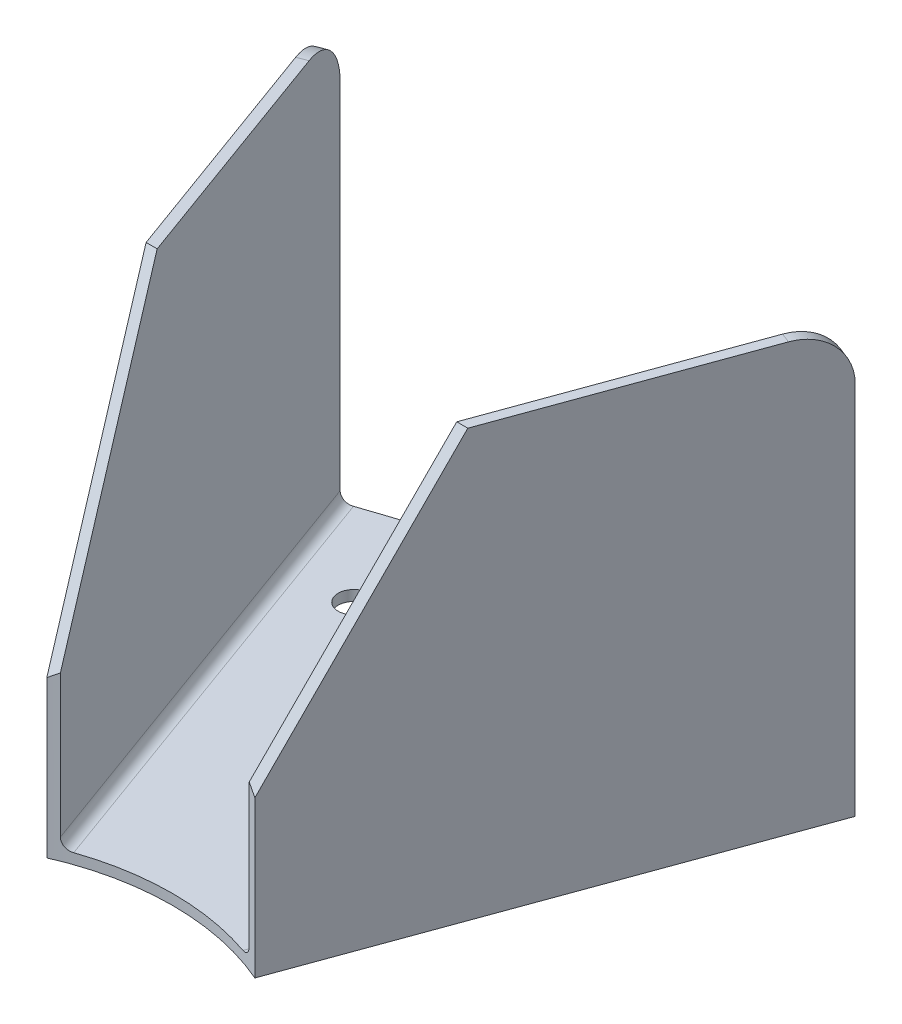
ISO-10303-21;
HEADER;
FILE_DESCRIPTION(('STEP AP214'),'2;1');
FILE_NAME('part.step','',(''),(''),'','','');
FILE_SCHEMA(('AUTOMOTIVE_DESIGN { 1 0 10303 214 1 1 1 1 }'));
ENDSEC;
DATA;
#1=APPLICATION_CONTEXT('core data for automotive mechanical design processes');
#2=APPLICATION_PROTOCOL_DEFINITION('international standard','automotive_design',2000,#1);
#3=PRODUCT_CONTEXT('',#1,'mechanical');
#4=PRODUCT('Part','Part','',(#3));
#5=PRODUCT_RELATED_PRODUCT_CATEGORY('part','',(#4));
#6=PRODUCT_DEFINITION_FORMATION('','',#4);
#7=PRODUCT_DEFINITION_CONTEXT('part definition',#1,'design');
#8=PRODUCT_DEFINITION('design','',#6,#7);
#9=PRODUCT_DEFINITION_SHAPE('','',#8);
#10=(LENGTH_UNIT() NAMED_UNIT(*) SI_UNIT(.MILLI.,.METRE.));
#11=(NAMED_UNIT(*) PLANE_ANGLE_UNIT() SI_UNIT($,.RADIAN.));
#12=(NAMED_UNIT(*) SI_UNIT($,.STERADIAN.) SOLID_ANGLE_UNIT());
#13=UNCERTAINTY_MEASURE_WITH_UNIT(LENGTH_MEASURE(1.E-05),#10,'distance_accuracy_value','');
#14=(GEOMETRIC_REPRESENTATION_CONTEXT(3) GLOBAL_UNCERTAINTY_ASSIGNED_CONTEXT((#13)) GLOBAL_UNIT_ASSIGNED_CONTEXT((#10,
#11,#12)) REPRESENTATION_CONTEXT('',''));
#15=CARTESIAN_POINT('',(0.,0.,0.));
#16=DIRECTION('',(0.,0.,1.));
#17=DIRECTION('',(1.,0.,0.));
#18=AXIS2_PLACEMENT_3D('',#15,#16,#17);
#19=CARTESIAN_POINT('',(-0.526472401888214,40.,0.191620283449944));
#20=DIRECTION('',(0.939692620785908,0.,-0.34202014332567));
#21=DIRECTION('',(-0.34202014332567,0.,-0.939692620785908));
#22=AXIS2_PLACEMENT_3D('',#19,#20,#21);
#23=PLANE('',#22);
#24=DIRECTION('',(-0.1790444180605,0.852031291837945,-0.491920495700615));
#25=VECTOR('',#24,1.);
#26=CARTESIAN_POINT('',(-10.5976391005752,21.9082050838659,-27.4786828087559));
#27=LINE('',#26,#25);
#28=CARTESIAN_POINT('',(-9.0748285709005,14.6614992838294,-23.2947952643669));
#29=VERTEX_POINT('',#28);
#30=CARTESIAN_POINT('',(-14.3994183585197,40.,-37.9239854737093));
#31=VERTEX_POINT('',#30);
#32=EDGE_CURVE('E62',#29,#31,#27,.T.);
#33=ORIENTED_EDGE('',*,*,#32,.F.);
#34=DIRECTION('',(0.,-1.,0.));
#35=VECTOR('',#34,1.);
#36=CARTESIAN_POINT('',(-9.0748285709005,40.,-23.2947952643669));
#37=LINE('',#36,#35);
#38=CARTESIAN_POINT('',(-9.0748285709005,1.,-23.2947952643669));
#39=VERTEX_POINT('',#38);
#40=EDGE_CURVE('E172',#29,#39,#37,.T.);
#41=ORIENTED_EDGE('',*,*,#40,.T.);
#42=DIRECTION('',(0.34202014332567,0.,0.939692620785908));
#43=VECTOR('',#42,1.);
#44=CARTESIAN_POINT('',(-24.4671155850919,1.,-65.5847562696222));
#45=LINE('',#44,#43);
#46=CARTESIAN_POINT('',(-24.4671155850919,1.,-65.5847562696222));
#47=VERTEX_POINT('',#46);
#48=EDGE_CURVE('E203',#39,#47,#45,.F.);
#49=ORIENTED_EDGE('',*,*,#48,.T.);
#50=DIRECTION('',(0.,-1.,0.));
#51=VECTOR('',#50,1.);
#52=CARTESIAN_POINT('',(-24.4671155850919,40.,-65.5847562696222));
#53=LINE('',#52,#51);
#54=CARTESIAN_POINT('',(-24.4671155850919,35.,-65.5847562696222));
#55=VERTEX_POINT('',#54);
#56=EDGE_CURVE('E188',#55,#47,#53,.T.);
#57=ORIENTED_EDGE('',*,*,#56,.F.);
#58=CARTESIAN_POINT('',(-24.4671155850919,35.,-65.5847562696222));
#59=CARTESIAN_POINT('',(-24.4671207581272,35.1406269312942,-65.5847704824198));
#60=CARTESIAN_POINT('',(-24.4650866069406,35.2812516905193,-65.5791816979669));
#61=CARTESIAN_POINT('',(-24.4569770188882,35.5614950485873,-65.556900787912));
#62=CARTESIAN_POINT('',(-24.4509017761162,35.7011136954282,-65.5402091955782));
#63=CARTESIAN_POINT('',(-24.434753469163,35.9782518827279,-65.4958420868619));
#64=CARTESIAN_POINT('',(-24.4246834316945,36.1157729307322,-65.4681748863041));
#65=CARTESIAN_POINT('',(-24.4006188018623,36.3878456902409,-65.4020578592325));
#66=CARTESIAN_POINT('',(-24.3866242573618,36.5223974379372,-65.3636081642219));
#67=CARTESIAN_POINT('',(-24.3548047471376,36.7876174779682,-65.2761847783828));
#68=CARTESIAN_POINT('',(-24.3369786252033,36.9182845845017,-65.2272079108918));
#69=CARTESIAN_POINT('',(-24.2976180117253,37.1748116237546,-65.1190655141452));
#70=CARTESIAN_POINT('',(-24.2760821518647,37.3006697617088,-65.0598962254695));
#71=CARTESIAN_POINT('',(-24.2294725130444,37.5465654777314,-64.9318372952818));
#72=CARTESIAN_POINT('',(-24.2044006685696,37.6666061904979,-64.8629529687234));
#73=CARTESIAN_POINT('',(-24.1508785102683,37.9001306439413,-64.7159020473499));
#74=CARTESIAN_POINT('',(-24.122426955461,38.0136119532219,-64.6377320429686));
#75=CARTESIAN_POINT('',(-24.062366118198,38.2331225135462,-64.4727162487948));
#76=CARTESIAN_POINT('',(-24.0307579967945,38.3391544803486,-64.3858736489675));
#77=CARTESIAN_POINT('',(-23.9645875878421,38.5430968254675,-64.2040719445345));
#78=CARTESIAN_POINT('',(-23.9300242041962,38.6410041636235,-64.1091098284275));
#79=CARTESIAN_POINT('',(-23.8582052344406,38.8279413115187,-63.9117888307355));
#80=CARTESIAN_POINT('',(-23.8209501016692,38.9169726101575,-63.8094311946873));
#81=CARTESIAN_POINT('',(-23.7439936596898,39.0855736702505,-63.5979951080673));
#82=CARTESIAN_POINT('',(-23.7042914852554,39.1651400556211,-63.4889142803057));
#83=CARTESIAN_POINT('',(-23.6227332726172,39.3142121744254,-63.264834932711));
#84=CARTESIAN_POINT('',(-23.5808771340836,39.3837174386453,-63.1498361372246));
#85=CARTESIAN_POINT('',(-23.4953108629168,39.512168726659,-62.9147447393268));
#86=CARTESIAN_POINT('',(-23.4516007222954,39.5711147049515,-62.7946521149683));
#87=CARTESIAN_POINT('',(-23.362656654915,39.6780026626812,-62.5502802982461));
#88=CARTESIAN_POINT('',(-23.3174234705589,39.725949916853,-62.4260031456179));
#89=CARTESIAN_POINT('',(-23.2257534026826,39.8105248265287,-62.1741417040877));
#90=CARTESIAN_POINT('',(-23.1793167835459,39.8471549458339,-62.0465581415738));
#91=CARTESIAN_POINT('',(-23.0708299962405,39.9185269177989,-61.748493143143));
#92=CARTESIAN_POINT('',(-23.0084479991648,39.9490783223824,-61.5771000147972));
#93=CARTESIAN_POINT('',(-22.9143740615055,39.979627736881,-61.3186339953189));
#94=CARTESIAN_POINT('',(-22.8829485663546,39.9872645862398,-61.2322931569967));
#95=CARTESIAN_POINT('',(-22.8200032508854,39.9974501039267,-61.0593523240847));
#96=CARTESIAN_POINT('',(-22.7884834366713,39.9999990946953,-60.972752346266));
#97=CARTESIAN_POINT('',(-22.7569558779202,40.,-60.8861310905069));
#98=B_SPLINE_CURVE_WITH_KNOTS('',3,(#58,#59,#60,#61,#62,#63,#64,#65,#66,#67,#68,#69,#70,#71,#72,
#73,#74,#75,#76,#77,#78,#79,#80,#81,#82,#83,#84,#85,#86,#87,#88,#89,#90,#91,#92,#93,#94,#95,#96,
#97),.UNSPECIFIED.,.F.,.F.,(4,2,2,2,2,2,2,2,2,2,2,2,2,2,2,2,2,2,2,4),(0.,0.421752020546427,
0.843483785798195,1.26489662843039,1.68630433173494,2.10783937732101,2.5295302380873,
2.95099128653435,3.37260757052777,3.7940693423049,4.21568811662169,4.63723604763235,
5.05893389449125,5.48065140145772,5.902370725614,6.32388737810006,6.74531219937262,
7.29882633295202,7.57530467568675,7.85176549618931),.UNSPECIFIED.);
#99=CARTESIAN_POINT('',(-22.7569558779202,40.,-60.8861310905069));
#100=VERTEX_POINT('',#99);
#101=EDGE_CURVE('E336',#55,#100,#98,.T.);
#102=ORIENTED_EDGE('',*,*,#101,.T.);
#103=DIRECTION('',(0.34202014332567,0.,0.939692620785908));
#104=VECTOR('',#103,1.);
#105=CARTESIAN_POINT('',(-0.526472401888214,40.,0.191620283449944));
#106=LINE('',#105,#104);
#107=EDGE_CURVE('E173',#100,#31,#106,.T.);
#108=ORIENTED_EDGE('',*,*,#107,.T.);
#109=EDGE_LOOP('',(#33,#41,#49,#57,#102,#108));
#110=FACE_BOUND('',#109,.T.);
#111=ADVANCED_FACE('F45',(#110),#23,.T.);
#112=CARTESIAN_POINT('',(0.,40.,0.));
#113=DIRECTION('',(0.,-1.,0.));
#114=DIRECTION('',(0.,0.,-1.));
#115=AXIS2_PLACEMENT_3D('',#112,#113,#114);
#116=CYLINDRICAL_SURFACE('',#115,70.);
#117=DIRECTION('',(0.,-1.,0.));
#118=VECTOR('',#117,1.);
#119=CARTESIAN_POINT('',(-25.401627045652,40.,-65.2285010055697));
#120=LINE('',#119,#118);
#121=CARTESIAN_POINT('',(-25.401627045652,35.,-65.2285010055697));
#122=VERTEX_POINT('',#121);
#123=CARTESIAN_POINT('',(-25.401627045652,-1.,-65.2285010055697));
#124=VERTEX_POINT('',#123);
#125=EDGE_CURVE('E185',#122,#124,#120,.T.);
#126=ORIENTED_EDGE('',*,*,#125,.F.);
#127=CARTESIAN_POINT('',(0.,35.,0.));
#128=DIRECTION('',(0.,1.,0.));
#129=DIRECTION('',(0.,0.,1.));
#130=AXIS2_PLACEMENT_3D('',#127,#128,#129);
#131=CIRCLE('',#130,70.);
#132=EDGE_CURVE('E339',#122,#55,#131,.F.);
#133=ORIENTED_EDGE('',*,*,#132,.T.);
#134=ORIENTED_EDGE('',*,*,#56,.T.);
#135=CARTESIAN_POINT('',(-24.4671155850919,1.,-65.5847562696222));
#136=CARTESIAN_POINT('',(-24.4671153767392,0.971865612568525,-65.5847562426265));
#137=CARTESIAN_POINT('',(-24.4660024294023,0.943744704289793,-65.5851715560531));
#138=CARTESIAN_POINT('',(-24.4615622153202,0.887704127962781,-65.5868278109534));
#139=CARTESIAN_POINT('',(-24.4582350551391,0.859784450295172,-65.5880687126938));
#140=CARTESIAN_POINT('',(-24.4449634506258,0.77667614422931,-65.5930168311897));
#141=CARTESIAN_POINT('',(-24.4317287963177,0.722044228048577,-65.5979494988282));
#142=CARTESIAN_POINT('',(-24.3968470145749,0.61592861285215,-65.610930476103));
#143=CARTESIAN_POINT('',(-24.3751958546124,0.564446436649627,-65.6189802792184));
#144=CARTESIAN_POINT('',(-24.3240890918427,0.466092124489214,-65.6379419982962));
#145=CARTESIAN_POINT('',(-24.2946348585797,0.419219181526669,-65.6488534120041));
#146=CARTESIAN_POINT('',(-24.2287459966497,0.331412703354947,-65.6731992310241));
#147=CARTESIAN_POINT('',(-24.1923112914872,0.290479233242181,-65.6866336639847));
#148=CARTESIAN_POINT('',(-24.113474343177,0.215703858837523,-65.7156154576214));
#149=CARTESIAN_POINT('',(-24.0710709367759,0.181863340114439,-65.7311632301508));
#150=CARTESIAN_POINT('',(-23.9814928716657,0.122241073469341,-65.7638979373127));
#151=CARTESIAN_POINT('',(-23.9343173551698,0.0964607777916381,-65.7810851666058));
#152=CARTESIAN_POINT('',(-23.8365371381719,0.0537087244860233,-65.8165799380348));
#153=CARTESIAN_POINT('',(-23.7859344662295,0.0367318067076425,-65.8348868168298));
#154=CARTESIAN_POINT('',(-23.7004723700059,0.0162868888596364,-65.8656884132503));
#155=CARTESIAN_POINT('',(-23.6661630190284,0.0101829767043095,-65.8780241062779));
#156=CARTESIAN_POINT('',(-23.5971497167369,0.00204006450139895,-65.9027759717542));
#157=CARTESIAN_POINT('',(-23.5624463948189,-4.69444307307017E-06,-65.915192005076));
#158=CARTESIAN_POINT('',(-23.5277174035234,0.,-65.927585378049));
#159=B_SPLINE_CURVE_WITH_KNOTS('',3,(#135,#136,#137,#138,#139,#140,#141,#142,#143,#144,#145,
#146,#147,#148,#149,#150,#151,#152,#153,#154,#155,#156,#157,#158),.UNSPECIFIED.,.F.,.F.,(4,2,2,
2,2,2,2,2,2,2,2,4),(0.,0.084351317746401,0.16869857618304,0.337114638855711,0.50561149292018,
0.674078793096854,0.842547939529672,1.01104996486976,1.17958233245656,1.34801580184459,
1.4587063183046,1.56923968076844),.UNSPECIFIED.);
#160=CARTESIAN_POINT('',(-23.5277174035234,0.,-65.927585378049));
#161=VERTEX_POINT('',#160);
#162=EDGE_CURVE('E249',#47,#161,#159,.T.);
#163=ORIENTED_EDGE('',*,*,#162,.T.);
#164=CARTESIAN_POINT('',(0.,0.,0.));
#165=DIRECTION('',(0.,1.,0.));
#166=DIRECTION('',(0.,0.,1.));
#167=AXIS2_PLACEMENT_3D('',#164,#165,#166);
#168=CIRCLE('',#167,70.);
#169=CARTESIAN_POINT('',(23.5277174035233,0.,-65.927585378049));
#170=VERTEX_POINT('',#169);
#171=EDGE_CURVE('E388',#170,#161,#168,.T.);
#172=ORIENTED_EDGE('',*,*,#171,.F.);
#173=CARTESIAN_POINT('',(23.5277174035233,0.,-65.927585378049));
#174=CARTESIAN_POINT('',(23.5542133133953,1.85724415020578E-07,-65.9181298273006));
#175=CARTESIAN_POINT('',(23.5806907610956,0.00118785924776186,-65.9086626334271));
#176=CARTESIAN_POINT('',(23.6334449436331,0.00592601743433827,-65.8897644803122));
#177=CARTESIAN_POINT('',(23.6597216880303,0.0094763888365024,-65.8803335193558));
#178=CARTESIAN_POINT('',(23.7379228249128,0.023637866369052,-65.8522138893208));
#179=CARTESIAN_POINT('',(23.7893067113295,0.037759429242583,-65.8336668507775));
#180=CARTESIAN_POINT('',(23.8890737153025,0.0749723676156303,-65.7975302109461));
#181=CARTESIAN_POINT('',(23.9374553788215,0.0980680507436286,-65.7799410740861));
#182=CARTESIAN_POINT('',(24.029852781733,0.152571251529126,-65.7462439532642));
#183=CARTESIAN_POINT('',(24.0738692856998,0.183977310045192,-65.7301357099543));
#184=CARTESIAN_POINT('',(24.1562990038814,0.254211066845318,-65.6998869894229));
#185=CARTESIAN_POINT('',(24.1947121426437,0.29303886505115,-65.685746538699));
#186=CARTESIAN_POINT('',(24.2648657343731,0.377024198843788,-65.659863635312));
#187=CARTESIAN_POINT('',(24.2966048792724,0.422182972383206,-65.6481216527491));
#188=CARTESIAN_POINT('',(24.3525169090188,0.517547968715458,-65.6274013865054));
#189=CARTESIAN_POINT('',(24.3766878726105,0.567755468909185,-65.6184238046038));
#190=CARTESIAN_POINT('',(24.4167670542365,0.671776833091942,-65.6035208401525));
#191=CARTESIAN_POINT('',(24.4326801101471,0.725588564637894,-65.5975936705426));
#192=CARTESIAN_POINT('',(24.4518462127297,0.816441020592758,-65.5904511519983));
#193=CARTESIAN_POINT('',(24.4575688760682,0.852910338169047,-65.5883172005882));
#194=CARTESIAN_POINT('',(24.4652030065165,0.926248007012693,-65.5854697822946));
#195=CARTESIAN_POINT('',(24.4671198701293,0.963115718626204,-65.5847543040633));
#196=CARTESIAN_POINT('',(24.4671155850919,1.,-65.5847562696222));
#197=B_SPLINE_CURVE_WITH_KNOTS('',3,(#173,#174,#175,#176,#177,#178,#179,#180,#181,#182,#183,
#184,#185,#186,#187,#188,#189,#190,#191,#192,#193,#194,#195,#196),.UNSPECIFIED.,.F.,.F.,(4,2,2,
2,2,2,2,2,2,2,2,4),(0.,0.0843458319249471,0.168687620840082,0.337092595899858,0.505578506358324,
0.674034853551556,0.842493468897966,1.01098507053813,1.17951941077155,1.34795490376494,
1.45867589442517,1.56923977379668),.UNSPECIFIED.);
#198=CARTESIAN_POINT('',(24.4671155850919,1.,-65.5847562696222));
#199=VERTEX_POINT('',#198);
#200=EDGE_CURVE('E207',#170,#199,#197,.T.);
#201=ORIENTED_EDGE('',*,*,#200,.T.);
#202=DIRECTION('',(0.,-1.,0.));
#203=VECTOR('',#202,1.);
#204=CARTESIAN_POINT('',(24.4671155850919,40.,-65.5847562696222));
#205=LINE('',#204,#203);
#206=CARTESIAN_POINT('',(24.4671155850919,35.,-65.5847562696222));
#207=VERTEX_POINT('',#206);
#208=EDGE_CURVE('E358',#207,#199,#205,.T.);
#209=ORIENTED_EDGE('',*,*,#208,.F.);
#210=CARTESIAN_POINT('',(0.,35.,0.));
#211=DIRECTION('',(0.,1.,0.));
#212=DIRECTION('',(0.,0.,1.));
#213=AXIS2_PLACEMENT_3D('',#210,#211,#212);
#214=CIRCLE('',#213,70.);
#215=CARTESIAN_POINT('',(25.401627045652,35.,-65.2285010055697));
#216=VERTEX_POINT('',#215);
#217=EDGE_CURVE('E265',#207,#216,#214,.F.);
#218=ORIENTED_EDGE('',*,*,#217,.T.);
#219=DIRECTION('',(0.,1.,0.));
#220=VECTOR('',#219,1.);
#221=CARTESIAN_POINT('',(25.401627045652,-1.,-65.2285010055697));
#222=LINE('',#221,#220);
#223=CARTESIAN_POINT('',(25.401627045652,-1.,-65.2285010055697));
#224=VERTEX_POINT('',#223);
#225=EDGE_CURVE('E179',#224,#216,#222,.T.);
#226=ORIENTED_EDGE('',*,*,#225,.F.);
#227=CARTESIAN_POINT('',(0.,-1.,0.));
#228=DIRECTION('',(0.,1.,0.));
#229=DIRECTION('',(0.,0.,1.));
#230=AXIS2_PLACEMENT_3D('',#227,#228,#229);
#231=CIRCLE('',#230,70.);
#232=EDGE_CURVE('E391',#224,#124,#231,.T.);
#233=ORIENTED_EDGE('',*,*,#232,.T.);
#234=EDGE_LOOP('',(#126,#133,#134,#163,#172,#201,#209,#218,#226,#233));
#235=FACE_BOUND('',#234,.T.);
#236=ADVANCED_FACE('F224',(#235),#116,.T.);
#237=CARTESIAN_POINT('',(-1.46616502267413,40.,0.533640426775616));
#238=DIRECTION('',(-0.939692620785908,0.,0.342020143325669));
#239=DIRECTION('',(0.342020143325669,0.,0.939692620785908));
#240=AXIS2_PLACEMENT_3D('',#237,#238,#239);
#241=PLANE('',#240);
#242=DIRECTION('',(0.1790444180605,-0.852031291837945,0.491920495700615));
#243=VECTOR('',#242,1.);
#244=CARTESIAN_POINT('',(-11.6277026287445,21.7458632250048,-27.3849546928417));
#245=LINE('',#244,#243);
#246=CARTESIAN_POINT('',(-15.4635961309956,40.,-37.9239854737093));
#247=VERTEX_POINT('',#246);
#248=CARTESIAN_POINT('',(-10.,14.,-22.9128784747792));
#249=VERTEX_POINT('',#248);
#250=EDGE_CURVE('E147',#247,#249,#245,.T.);
#251=ORIENTED_EDGE('',*,*,#250,.F.);
#252=DIRECTION('',(-0.342020143325669,0.,-0.939692620785908));
#253=VECTOR('',#252,1.);
#254=CARTESIAN_POINT('',(-1.46616502267413,40.,0.533640426775616));
#255=LINE('',#254,#253);
#256=CARTESIAN_POINT('',(-23.6910686626468,40.,-60.5287804736041));
#257=VERTEX_POINT('',#256);
#258=EDGE_CURVE('E160',#247,#257,#255,.T.);
#259=ORIENTED_EDGE('',*,*,#258,.T.);
#260=CARTESIAN_POINT('',(-23.6910686626468,40.,-60.5287804736041));
#261=CARTESIAN_POINT('',(-23.7391896838179,40.0000151025519,-60.6609918926727));
#262=CARTESIAN_POINT('',(-23.7873099715012,39.9940654078161,-60.7932012965002));
#263=CARTESIAN_POINT('',(-23.8832063556476,39.9703453529896,-61.0566744465499));
#264=CARTESIAN_POINT('',(-23.9309824682565,39.9525755510917,-61.187938237132));
#265=CARTESIAN_POINT('',(-24.0258169673676,39.9053418333248,-61.448493882025));
#266=CARTESIAN_POINT('',(-24.0728758631561,39.8758866593271,-61.5777871355885));
#267=CARTESIAN_POINT('',(-24.1659776552063,39.8054960066952,-61.833582206957));
#268=CARTESIAN_POINT('',(-24.2120205640278,39.7645606700679,-61.9600840592701));
#269=CARTESIAN_POINT('',(-24.3027777096353,39.6714842674924,-62.209437267481));
#270=CARTESIAN_POINT('',(-24.3474915349939,39.619339771954,-62.3322874929913));
#271=CARTESIAN_POINT('',(-24.435274084758,39.5042015659337,-62.5734680662902));
#272=CARTESIAN_POINT('',(-24.4783421949447,39.4412038521816,-62.6917967265269));
#273=CARTESIAN_POINT('',(-24.5624862249753,39.3048574154256,-62.9229805490177));
#274=CARTESIAN_POINT('',(-24.6035632228522,39.2315143796553,-63.0358386731434));
#275=CARTESIAN_POINT('',(-24.6834728891096,39.0749431046054,-63.2553886767819));
#276=CARTESIAN_POINT('',(-24.7223047254301,38.991711234979,-63.3620782702284));
#277=CARTESIAN_POINT('',(-24.7974116198904,38.8160213162004,-63.5684327668035));
#278=CARTESIAN_POINT('',(-24.8336880013553,38.7235681030836,-63.6681013057377));
#279=CARTESIAN_POINT('',(-24.9034612563669,38.5300197071514,-63.859801748364));
#280=CARTESIAN_POINT('',(-24.936957089355,38.4289213175469,-63.9518307931447));
#281=CARTESIAN_POINT('',(-25.0009102761393,38.2188486120241,-64.1275407297365));
#282=CARTESIAN_POINT('',(-25.0313681400013,38.1098756235435,-64.2112230229422));
#283=CARTESIAN_POINT('',(-25.0890452341371,37.8847733295136,-64.3696895367001));
#284=CARTESIAN_POINT('',(-25.1162633091563,37.7686414935115,-64.4444705832165));
#285=CARTESIAN_POINT('',(-25.1672482094666,37.5301108778262,-64.5845504455523));
#286=CARTESIAN_POINT('',(-25.1910158583261,37.407713603081,-64.6498515241073));
#287=CARTESIAN_POINT('',(-25.2349383911855,37.1574984720581,-64.7705276913435));
#288=CARTESIAN_POINT('',(-25.2550932607186,37.0296805940772,-64.825902740278));
#289=CARTESIAN_POINT('',(-25.2916378387074,36.7695904770895,-64.9263081431056));
#290=CARTESIAN_POINT('',(-25.3080293649074,36.6373204240919,-64.9713434912105));
#291=CARTESIAN_POINT('',(-25.3369392119284,36.3692618934739,-65.0507726431006));
#292=CARTESIAN_POINT('',(-25.3494583787564,36.2334741914013,-65.0851687712708));
#293=CARTESIAN_POINT('',(-25.3738267235649,35.9164950294532,-65.1521202483817));
#294=CARTESIAN_POINT('',(-25.3842514982424,35.7343404307351,-65.180762081411));
#295=CARTESIAN_POINT('',(-25.3946755982077,35.4596490080894,-65.2094020606839));
#296=CARTESIAN_POINT('',(-25.3972814522101,35.367888659259,-65.2165615857137));
#297=CARTESIAN_POINT('',(-25.4007569684161,35.1840930461592,-65.2261104880108));
#298=CARTESIAN_POINT('',(-25.4016267394756,35.0920577994889,-65.2285001643569));
#299=CARTESIAN_POINT('',(-25.401627045652,35.,-65.2285010055697));
#300=B_SPLINE_CURVE_WITH_KNOTS('',3,(#260,#261,#262,#263,#264,#265,#266,#267,#268,#269,#270,
#271,#272,#273,#274,#275,#276,#277,#278,#279,#280,#281,#282,#283,#284,#285,#286,#287,#288,#289,
#290,#291,#292,#293,#294,#295,#296,#297,#298,#299),.UNSPECIFIED.,.F.,.F.,(4,2,2,2,2,2,2,2,2,2,2,
2,2,2,2,2,2,2,2,4),(0.,0.421960597060156,0.843901268868758,1.26552687870681,1.68714727336697,
2.10889685243423,2.53080233056833,2.95247676799117,3.37430648987651,3.79591613938198,
4.21768286227534,4.63937865217769,5.06122436411695,5.48296922125126,5.90471576713959,
6.32625817330136,6.7477084185655,7.30048712610159,7.57659771257018,7.85269098581856),.UNSPECIFIED.);
#301=EDGE_CURVE('E258',#257,#122,#300,.T.);
#302=ORIENTED_EDGE('',*,*,#301,.T.);
#303=ORIENTED_EDGE('',*,*,#125,.T.);
#304=DIRECTION('',(-0.342020143325669,0.,-0.939692620785908));
#305=VECTOR('',#304,1.);
#306=CARTESIAN_POINT('',(-1.46616502267413,-1.,0.533640426775616));
#307=LINE('',#306,#305);
#308=CARTESIAN_POINT('',(-10.,-1.,-22.9128784747792));
#309=VERTEX_POINT('',#308);
#310=EDGE_CURVE('E394',#309,#124,#307,.T.);
#311=ORIENTED_EDGE('',*,*,#310,.F.);
#312=DIRECTION('',(0.,-1.,0.));
#313=VECTOR('',#312,1.);
#314=CARTESIAN_POINT('',(-10.,40.,-22.9128784747792));
#315=LINE('',#314,#313);
#316=EDGE_CURVE('E163',#249,#309,#315,.T.);
#317=ORIENTED_EDGE('',*,*,#316,.F.);
#318=EDGE_LOOP('',(#251,#259,#302,#303,#311,#317));
#319=FACE_BOUND('',#318,.T.);
#320=ADVANCED_FACE('F159',(#319),#241,.T.);
#321=CARTESIAN_POINT('',(0.,40.,0.));
#322=DIRECTION('',(0.,-1.,0.));
#323=DIRECTION('',(0.,0.,-1.));
#324=AXIS2_PLACEMENT_3D('',#321,#322,#323);
#325=CYLINDRICAL_SURFACE('',#324,25.);
#326=CARTESIAN_POINT('',(0.,-25.6862696659694,0.));
#327=DIRECTION('',(0.,-0.499999999999995,-0.866025403784442));
#328=DIRECTION('',(0.,-0.866025403784442,0.499999999999995));
#329=AXIS2_PLACEMENT_3D('',#326,#327,#328);
#330=ELLIPSE('',#329,50.0000000000006,25.);
#331=EDGE_CURVE('E165',#249,#29,#330,.T.);
#332=ORIENTED_EDGE('',*,*,#331,.F.);
#333=ORIENTED_EDGE('',*,*,#316,.T.);
#334=CARTESIAN_POINT('',(0.,-1.,0.));
#335=DIRECTION('',(0.,1.,0.));
#336=DIRECTION('',(0.,0.,1.));
#337=AXIS2_PLACEMENT_3D('',#334,#335,#336);
#338=CIRCLE('',#337,25.);
#339=CARTESIAN_POINT('',(10.,-1.,-22.9128784747792));
#340=VERTEX_POINT('',#339);
#341=EDGE_CURVE('E384',#340,#309,#338,.T.);
#342=ORIENTED_EDGE('',*,*,#341,.F.);
#343=DIRECTION('',(0.,1.,0.));
#344=VECTOR('',#343,1.);
#345=CARTESIAN_POINT('',(10.,-1.,-22.9128784747792));
#346=LINE('',#345,#344);
#347=CARTESIAN_POINT('',(10.,14.,-22.9128784747792));
#348=VERTEX_POINT('',#347);
#349=EDGE_CURVE('E368',#340,#348,#346,.T.);
#350=ORIENTED_EDGE('',*,*,#349,.T.);
#351=CARTESIAN_POINT('',(9.0748285709005,14.6614992838294,-23.2947952643668));
#352=VERTEX_POINT('',#351);
#353=EDGE_CURVE('E407',#352,#348,#330,.T.);
#354=ORIENTED_EDGE('',*,*,#353,.F.);
#355=DIRECTION('',(0.,-1.,0.));
#356=VECTOR('',#355,1.);
#357=CARTESIAN_POINT('',(9.0748285709005,40.,-23.2947952643668));
#358=LINE('',#357,#356);
#359=CARTESIAN_POINT('',(9.0748285709005,1.,-23.2947952643668));
#360=VERTEX_POINT('',#359);
#361=EDGE_CURVE('E377',#352,#360,#358,.T.);
#362=ORIENTED_EDGE('',*,*,#361,.T.);
#363=CARTESIAN_POINT('',(9.0748285709005,1.,-23.2947952643668));
#364=CARTESIAN_POINT('',(9.07482830705477,0.971868103494194,-23.2947950734388));
#365=CARTESIAN_POINT('',(9.07372147438186,0.94374968896724,-23.2952265830106));
#366=CARTESIAN_POINT('',(9.06930528577955,0.887714159846422,-23.2969463646159));
#367=CARTESIAN_POINT('',(9.06599603821426,0.859797035416911,-23.2982345944965));
#368=CARTESIAN_POINT('',(9.05279506189768,0.776697026194799,-23.3033687808813));
#369=CARTESIAN_POINT('',(9.03963001641124,0.722070917212311,-23.3084842821401));
#370=CARTESIAN_POINT('',(9.00492082368728,0.615966953607674,-23.321915512148));
#371=CARTESIAN_POINT('',(8.9833726998927,0.564490606522557,-23.3302327596425));
#372=CARTESIAN_POINT('',(8.93248647180526,0.466146370580404,-23.3497628509118));
#373=CARTESIAN_POINT('',(8.90314969697256,0.419277697099642,-23.360975200507));
#374=CARTESIAN_POINT('',(8.83748209084073,0.331471039244737,-23.3858961789567));
#375=CARTESIAN_POINT('',(8.80115019294262,0.290533960975921,-23.3996051884785));
#376=CARTESIAN_POINT('',(8.72248333708961,0.215750637711469,-23.4290427516867));
#377=CARTESIAN_POINT('',(8.6801472278408,0.181905755719179,-23.4447716926356));
#378=CARTESIAN_POINT('',(8.59065063002179,0.122277751460209,-23.4777126976069));
#379=CARTESIAN_POINT('',(8.5434897867395,0.0964952224998808,-23.4949248706611));
#380=CARTESIAN_POINT('',(8.44566522877194,0.0537374944591751,-23.530266376969));
#381=CARTESIAN_POINT('',(8.39500358690077,0.0367571334265541,-23.5483951658193));
#382=CARTESIAN_POINT('',(8.3093563832489,0.0163007529393733,-23.5787170659701));
#383=CARTESIAN_POINT('',(8.27494360080001,0.010191506374524,-23.5908168981122));
#384=CARTESIAN_POINT('',(8.2056879264752,0.00204162301502163,-23.6149961382841));
#385=CARTESIAN_POINT('',(8.17084571188354,-4.756919889739E-06,-23.6270755509933));
#386=CARTESIAN_POINT('',(8.13596052591459,0.,-23.6390809110837));
#387=B_SPLINE_CURVE_WITH_KNOTS('',3,(#363,#364,#365,#366,#367,#368,#369,#370,#371,#372,#373,
#374,#375,#376,#377,#378,#379,#380,#381,#382,#383,#384,#385,#386),.UNSPECIFIED.,.F.,.F.,(4,2,2,
2,2,2,2,2,2,2,2,4),(0.,0.0843438370761991,0.168683524539836,0.337082747325906,0.505561948755033,
0.674012410607218,0.84248857773778,1.01099709357862,1.17951800699837,1.34793998071929,
1.45868708233942,1.56927752356851),.UNSPECIFIED.);
#388=CARTESIAN_POINT('',(8.13596052591459,0.,-23.6390809110837));
#389=VERTEX_POINT('',#388);
#390=EDGE_CURVE('E217',#360,#389,#387,.T.);
#391=ORIENTED_EDGE('',*,*,#390,.T.);
#392=CARTESIAN_POINT('',(0.,0.,0.));
#393=DIRECTION('',(0.,1.,0.));
#394=DIRECTION('',(0.,0.,1.));
#395=AXIS2_PLACEMENT_3D('',#392,#393,#394);
#396=CIRCLE('',#395,25.);
#397=CARTESIAN_POINT('',(-8.13596052591459,0.,-23.6390809110837));
#398=VERTEX_POINT('',#397);
#399=EDGE_CURVE('E330',#389,#398,#396,.T.);
#400=ORIENTED_EDGE('',*,*,#399,.T.);
#401=CARTESIAN_POINT('',(-8.13596052591459,0.,-23.6390809110837));
#402=CARTESIAN_POINT('',(-8.16254753173167,1.76159121402265E-07,-23.6299306316912));
#403=CARTESIAN_POINT('',(-8.189106192456,0.00118627408261068,-23.6207393159381));
#404=CARTESIAN_POINT('',(-8.24200301697733,0.00591845482899653,-23.6023339655401));
#405=CARTESIAN_POINT('',(-8.26834119123296,0.00946442506325048,-23.593119932));
#406=CARTESIAN_POINT('',(-8.34669585397273,0.0236087773450397,-23.565562145836));
#407=CARTESIAN_POINT('',(-8.3981422842287,0.0377136933938954,-23.5472717807724));
#408=CARTESIAN_POINT('',(-8.49796262357287,0.0748844999840233,-23.5114323976636));
#409=CARTESIAN_POINT('',(-8.54633504008312,0.097954705493788,-23.493883741117));
#410=CARTESIAN_POINT('',(-8.63865838527667,0.152399056224153,-23.4600937367154));
#411=CARTESIAN_POINT('',(-8.68261006918227,0.183771779735337,-23.4438521656578));
#412=CARTESIAN_POINT('',(-8.76488337966146,0.253937756639258,-23.4132174434649));
#413=CARTESIAN_POINT('',(-8.80320403892196,0.292732282341182,-23.3988246099642));
#414=CARTESIAN_POINT('',(-8.87316278541617,0.376648551485546,-23.3723850803291));
#415=CARTESIAN_POINT('',(-8.90479955397331,0.421771540565381,-23.3603388471961));
#416=CARTESIAN_POINT('',(-8.96053246098834,0.517084147869913,-23.339017807902));
#417=CARTESIAN_POINT('',(-8.98462368145594,0.567277042462158,-23.3297448094394));
#418=CARTESIAN_POINT('',(-9.02457152963784,0.671274524594407,-23.3143211357452));
#419=CARTESIAN_POINT('',(-9.04043296380246,0.725076983253634,-23.3081686380915));
#420=CARTESIAN_POINT('',(-9.05956575720618,0.816004823547311,-23.3007367807924));
#421=CARTESIAN_POINT('',(-9.06528610148117,0.85255915630665,-23.2985110412531));
#422=CARTESIAN_POINT('',(-9.07291689769515,0.926070548441617,-23.2955399960625));
#423=CARTESIAN_POINT('',(-9.07483270433259,0.963026968082536,-23.2947926097081));
#424=CARTESIAN_POINT('',(-9.0748285709005,1.,-23.2947952643669));
#425=B_SPLINE_CURVE_WITH_KNOTS('',3,(#401,#402,#403,#404,#405,#406,#407,#408,#409,#410,#411,
#412,#413,#414,#415,#416,#417,#418,#419,#420,#421,#422,#423,#424),.UNSPECIFIED.,.F.,.F.,(4,2,2,
2,2,2,2,2,2,2,2,4),(0.,0.0843008684845338,0.168597715293847,0.33691010200898,0.505303597530897,
0.673668276267146,0.842061843430206,1.01048860229619,1.17902490995813,1.34746267608204,
1.45844862234098,1.56927825034976),.UNSPECIFIED.);
#426=EDGE_CURVE('E243',#398,#39,#425,.T.);
#427=ORIENTED_EDGE('',*,*,#426,.T.);
#428=ORIENTED_EDGE('',*,*,#40,.F.);
#429=EDGE_LOOP('',(#332,#333,#342,#350,#354,#362,#391,#400,#427,#428));
#430=FACE_BOUND('',#429,.T.);
#431=ADVANCED_FACE('F269',(#430),#325,.F.);
#432=CARTESIAN_POINT('',(0.,40.,0.));
#433=DIRECTION('',(0.,1.,0.));
#434=DIRECTION('',(0.,0.,1.));
#435=AXIS2_PLACEMENT_3D('',#432,#433,#434);
#436=PLANE('',#435);
#437=DIRECTION('',(1.,0.,0.));
#438=VECTOR('',#437,1.);
#439=CARTESIAN_POINT('',(-25.6836729452071,40.,-37.9239854737093));
#440=LINE('',#439,#438);
#441=EDGE_CURVE('E144',#247,#31,#440,.T.);
#442=ORIENTED_EDGE('',*,*,#441,.T.);
#443=ORIENTED_EDGE('',*,*,#107,.F.);
#444=CARTESIAN_POINT('',(0.,40.,0.));
#445=DIRECTION('',(0.,1.,0.));
#446=DIRECTION('',(0.,0.,1.));
#447=AXIS2_PLACEMENT_3D('',#444,#445,#446);
#448=CIRCLE('',#447,65.);
#449=EDGE_CURVE('E170',#100,#257,#448,.T.);
#450=ORIENTED_EDGE('',*,*,#449,.T.);
#451=ORIENTED_EDGE('',*,*,#258,.F.);
#452=EDGE_LOOP('',(#442,#443,#450,#451));
#453=FACE_BOUND('',#452,.T.);
#454=ADVANCED_FACE('F168',(#453),#436,.T.);
#455=CARTESIAN_POINT('',(1.46616502267414,-1.,0.533640426775618));
#456=DIRECTION('',(0.939692620785908,0.,0.342020143325669));
#457=DIRECTION('',(0.342020143325669,0.,-0.939692620785908));
#458=AXIS2_PLACEMENT_3D('',#455,#456,#457);
#459=PLANE('',#458);
#460=DIRECTION('',(0.1790444180605,0.852031291837945,-0.491920495700615));
#461=VECTOR('',#460,1.);
#462=CARTESIAN_POINT('',(5.37309330926964,-8.01838698810773,-10.200556820074));
#463=LINE('',#462,#461);
#464=CARTESIAN_POINT('',(15.4635961309956,40.,-37.9239854737093));
#465=VERTEX_POINT('',#464);
#466=EDGE_CURVE('E69',#348,#465,#463,.T.);
#467=ORIENTED_EDGE('',*,*,#466,.F.);
#468=ORIENTED_EDGE('',*,*,#349,.F.);
#469=DIRECTION('',(0.342020143325669,0.,-0.939692620785908));
#470=VECTOR('',#469,1.);
#471=CARTESIAN_POINT('',(1.46616502267414,-1.,0.533640426775618));
#472=LINE('',#471,#470);
#473=EDGE_CURVE('E366',#340,#224,#472,.T.);
#474=ORIENTED_EDGE('',*,*,#473,.T.);
#475=ORIENTED_EDGE('',*,*,#225,.T.);
#476=CARTESIAN_POINT('',(25.401627045652,35.,-65.2285010055697));
#477=CARTESIAN_POINT('',(25.401632224718,35.140604332688,-65.2285152349364));
#478=CARTESIAN_POINT('',(25.3995982808425,35.2812064829248,-65.2229270200661));
#479=CARTESIAN_POINT('',(25.3914895556073,35.5614046248623,-65.2006484805819));
#480=CARTESIAN_POINT('',(25.3854149699521,35.701000664962,-65.1839586936618));
#481=CARTESIAN_POINT('',(25.3692685176179,35.9780929815029,-65.139596680469));
#482=CARTESIAN_POINT('',(25.3591997007089,36.1155907770566,-65.1119328333711));
#483=CARTESIAN_POINT('',(25.3351381309192,36.3876173766949,-65.0458242136973));
#484=CARTESIAN_POINT('',(25.321145425595,36.5221462167412,-65.0073795717818));
#485=CARTESIAN_POINT('',(25.2893303456769,36.7873207481263,-64.9199683581088));
#486=CARTESIAN_POINT('',(25.2715068232694,36.9179652622343,-64.8709986327591));
#487=CARTESIAN_POINT('',(25.2321522525215,37.174448106862,-64.7628728382769));
#488=CARTESIAN_POINT('',(25.2106198362013,37.3002846430197,-64.7037130106508));
#489=CARTESIAN_POINT('',(25.1640179976753,37.5461388598625,-64.5756755115955));
#490=CARTESIAN_POINT('',(25.1389505042742,37.6661596660544,-64.5068031395137));
#491=CARTESIAN_POINT('',(25.0854380802137,37.8996464364777,-64.3597789627471));
#492=CARTESIAN_POINT('',(25.0569919088019,38.013109969801,-64.2816237491232));
#493=CARTESIAN_POINT('',(24.9969401762817,38.2325979541273,-64.1166329700248));
#494=CARTESIAN_POINT('',(24.9653354856021,38.3386244410088,-64.0297997960338));
#495=CARTESIAN_POINT('',(24.8991725414562,38.5425580259439,-63.8480186009885));
#496=CARTESIAN_POINT('',(24.8646131922173,38.6404620849368,-63.7530675693236));
#497=CARTESIAN_POINT('',(24.7928029293317,38.8273956657372,-63.5557704935602));
#498=CARTESIAN_POINT('',(24.7555524687592,38.916426675429,-63.4534256942731));
#499=CARTESIAN_POINT('',(24.6786059988485,39.0850309872726,-63.2420170056866));
#500=CARTESIAN_POINT('',(24.6389091242967,39.1646009138769,-63.1329507392327));
#501=CARTESIAN_POINT('',(24.5573536392379,39.3137002082647,-62.9088788856008));
#502=CARTESIAN_POINT('',(24.5154944845107,39.3832270314378,-62.7938718031903));
#503=CARTESIAN_POINT('',(24.4299218735376,39.5117225538671,-62.5587629868181));
#504=CARTESIAN_POINT('',(24.3862084088298,39.5706912049356,-62.4386612296072));
#505=CARTESIAN_POINT('',(24.2972572347954,39.6776263185342,-62.1942698875137));
#506=CARTESIAN_POINT('',(24.2520202633322,39.7255980216507,-62.069982329894));
#507=CARTESIAN_POINT('',(24.1603422134864,39.8102239296864,-61.8180989580831));
#508=CARTESIAN_POINT('',(24.1139013987839,39.8468805906321,-61.6905038683469));
#509=CARTESIAN_POINT('',(24.0053350920216,39.9183623705075,-61.3922203920039));
#510=CARTESIAN_POINT('',(23.9428757806452,39.9489755662982,-61.2206148443627));
#511=CARTESIAN_POINT('',(23.8486844346107,39.9795866785191,-60.9618262480246));
#512=CARTESIAN_POINT('',(23.8172195748807,39.9872389289769,-60.8753772564103));
#513=CARTESIAN_POINT('',(23.7541952835104,39.9974449696551,-60.7022194389932));
#514=CARTESIAN_POINT('',(23.7226358580488,39.9999990860064,-60.6155106301666));
#515=CARTESIAN_POINT('',(23.6910686626468,40.,-60.5287804736041));
#516=B_SPLINE_CURVE_WITH_KNOTS('',3,(#476,#477,#478,#479,#480,#481,#482,#483,#484,#485,#486,
#487,#488,#489,#490,#491,#492,#493,#494,#495,#496,#497,#498,#499,#500,#501,#502,#503,#504,#505,
#506,#507,#508,#509,#510,#511,#512,#513,#514,#515),.UNSPECIFIED.,.F.,.F.,(4,2,2,2,2,2,2,2,2,2,2,
2,2,2,2,2,2,2,2,4),(0.,0.421684213553173,0.843348004733403,1.26469045496549,1.6860277988571,
2.10749156294721,2.52911111292906,2.95050150303133,3.37204712163866,3.79347688883506,
4.21506363226905,4.63657956222539,5.05824543321139,5.48001795453234,5.90179240078004,
6.32336543097416,6.74484689069177,7.29905662352272,7.57588257555263,7.85269081827509),.UNSPECIFIED.);
#517=CARTESIAN_POINT('',(23.6910686626468,40.,-60.5287804736041));
#518=VERTEX_POINT('',#517);
#519=EDGE_CURVE('E55',#216,#518,#516,.T.);
#520=ORIENTED_EDGE('',*,*,#519,.T.);
#521=DIRECTION('',(0.342020143325669,0.,-0.939692620785908));
#522=VECTOR('',#521,1.);
#523=CARTESIAN_POINT('',(1.46616502267414,40.,0.533640426775618));
#524=LINE('',#523,#522);
#525=EDGE_CURVE('E325',#465,#518,#524,.T.);
#526=ORIENTED_EDGE('',*,*,#525,.F.);
#527=EDGE_LOOP('',(#467,#468,#474,#475,#520,#526));
#528=FACE_BOUND('',#527,.T.);
#529=ADVANCED_FACE('F277',(#528),#459,.T.);
#530=CARTESIAN_POINT('',(0.,-1.,0.));
#531=DIRECTION('',(0.,1.,0.));
#532=DIRECTION('',(0.,0.,1.));
#533=AXIS2_PLACEMENT_3D('',#530,#531,#532);
#534=PLANE('',#533);
#535=CARTESIAN_POINT('',(0.,-1.,-40.));
#536=DIRECTION('',(0.,1.,0.));
#537=DIRECTION('',(0.,0.,1.));
#538=AXIS2_PLACEMENT_3D('',#535,#536,#537);
#539=CIRCLE('',#538,1.5);
#540=CARTESIAN_POINT('',(0.,-1.,-38.5));
#541=VERTEX_POINT('',#540);
#542=EDGE_CURVE('E155',#541,#541,#539,.F.);
#543=ORIENTED_EDGE('',*,*,#542,.F.);
#544=EDGE_LOOP('',(#543));
#545=FACE_BOUND('',#544,.T.);
#546=CARTESIAN_POINT('',(-15.5291427061513,-1.,-57.9555495773441));
#547=DIRECTION('',(0.,1.,0.));
#548=DIRECTION('',(0.,0.,1.));
#549=AXIS2_PLACEMENT_3D('',#546,#547,#548);
#550=CIRCLE('',#549,1.5);
#551=CARTESIAN_POINT('',(-15.5291427061513,-1.,-56.4555495773441));
#552=VERTEX_POINT('',#551);
#553=EDGE_CURVE('E427',#552,#552,#550,.F.);
#554=ORIENTED_EDGE('',*,*,#553,.F.);
#555=EDGE_LOOP('',(#554));
#556=FACE_BOUND('',#555,.T.);
#557=CARTESIAN_POINT('',(15.5291427061513,-1.,-57.9555495773441));
#558=DIRECTION('',(0.,1.,0.));
#559=DIRECTION('',(0.,0.,1.));
#560=AXIS2_PLACEMENT_3D('',#557,#558,#559);
#561=CIRCLE('',#560,1.5);
#562=CARTESIAN_POINT('',(15.5291427061513,-1.,-56.4555495773441));
#563=VERTEX_POINT('',#562);
#564=EDGE_CURVE('E418',#563,#563,#561,.F.);
#565=ORIENTED_EDGE('',*,*,#564,.F.);
#566=EDGE_LOOP('',(#565));
#567=FACE_BOUND('',#566,.T.);
#568=ORIENTED_EDGE('',*,*,#341,.T.);
#569=ORIENTED_EDGE('',*,*,#310,.T.);
#570=ORIENTED_EDGE('',*,*,#232,.F.);
#571=ORIENTED_EDGE('',*,*,#473,.F.);
#572=EDGE_LOOP('',(#568,#569,#570,#571));
#573=FACE_BOUND('',#572,.T.);
#574=ADVANCED_FACE('F281',(#545,#556,#567,#573),#534,.F.);
#575=CARTESIAN_POINT('',(0.,0.,0.));
#576=DIRECTION('',(0.,1.,0.));
#577=DIRECTION('',(0.,0.,1.));
#578=AXIS2_PLACEMENT_3D('',#575,#576,#577);
#579=PLANE('',#578);
#580=CARTESIAN_POINT('',(0.,0.,-40.));
#581=DIRECTION('',(0.,1.,0.));
#582=DIRECTION('',(0.,0.,1.));
#583=AXIS2_PLACEMENT_3D('',#580,#581,#582);
#584=CIRCLE('',#583,1.5);
#585=CARTESIAN_POINT('',(0.,0.,-38.5));
#586=VERTEX_POINT('',#585);
#587=EDGE_CURVE('E431',#586,#586,#584,.T.);
#588=ORIENTED_EDGE('',*,*,#587,.F.);
#589=EDGE_LOOP('',(#588));
#590=FACE_BOUND('',#589,.T.);
#591=CARTESIAN_POINT('',(-15.5291427061513,0.,-57.9555495773441));
#592=DIRECTION('',(0.,1.,0.));
#593=DIRECTION('',(0.,0.,1.));
#594=AXIS2_PLACEMENT_3D('',#591,#592,#593);
#595=CIRCLE('',#594,1.5);
#596=CARTESIAN_POINT('',(-15.5291427061513,0.,-56.4555495773441));
#597=VERTEX_POINT('',#596);
#598=EDGE_CURVE('E422',#597,#597,#595,.T.);
#599=ORIENTED_EDGE('',*,*,#598,.F.);
#600=EDGE_LOOP('',(#599));
#601=FACE_BOUND('',#600,.T.);
#602=CARTESIAN_POINT('',(15.5291427061513,0.,-57.9555495773441));
#603=DIRECTION('',(0.,1.,0.));
#604=DIRECTION('',(0.,0.,1.));
#605=AXIS2_PLACEMENT_3D('',#602,#603,#604);
#606=CIRCLE('',#605,1.5);
#607=CARTESIAN_POINT('',(15.5291427061513,0.,-56.4555495773441));
#608=VERTEX_POINT('',#607);
#609=EDGE_CURVE('E423',#608,#608,#606,.T.);
#610=ORIENTED_EDGE('',*,*,#609,.F.);
#611=EDGE_LOOP('',(#610));
#612=FACE_BOUND('',#611,.T.);
#613=ORIENTED_EDGE('',*,*,#399,.F.);
#614=DIRECTION('',(0.342020143325669,0.,-0.939692620785908));
#615=VECTOR('',#614,1.);
#616=CARTESIAN_POINT('',(23.527422964306,0.,-65.9267764129479));
#617=LINE('',#616,#615);
#618=EDGE_CURVE('E195',#389,#170,#617,.T.);
#619=ORIENTED_EDGE('',*,*,#618,.T.);
#620=ORIENTED_EDGE('',*,*,#171,.T.);
#621=DIRECTION('',(0.34202014332567,0.,0.939692620785908));
#622=VECTOR('',#621,1.);
#623=CARTESIAN_POINT('',(-8.13513595011459,0.,-23.6368154076925));
#624=LINE('',#623,#622);
#625=EDGE_CURVE('E191',#161,#398,#624,.T.);
#626=ORIENTED_EDGE('',*,*,#625,.T.);
#627=EDGE_LOOP('',(#613,#619,#620,#626));
#628=FACE_BOUND('',#627,.T.);
#629=ADVANCED_FACE('F283',(#590,#601,#612,#628),#579,.T.);
#630=CARTESIAN_POINT('',(0.526472401888232,40.,0.19162028344995));
#631=DIRECTION('',(-0.939692620785908,0.,-0.342020143325669));
#632=DIRECTION('',(-0.342020143325669,0.,0.939692620785908));
#633=AXIS2_PLACEMENT_3D('',#630,#631,#632);
#634=PLANE('',#633);
#635=DIRECTION('',(-0.1790444180605,-0.852031291837945,0.491920495700615));
#636=VECTOR('',#635,1.);
#637=CARTESIAN_POINT('',(10.5976391005752,21.9082050838659,-27.4786828087559));
#638=LINE('',#637,#636);
#639=CARTESIAN_POINT('',(14.3994183585197,40.,-37.9239854737093));
#640=VERTEX_POINT('',#639);
#641=EDGE_CURVE('E154',#640,#352,#638,.T.);
#642=ORIENTED_EDGE('',*,*,#641,.F.);
#643=DIRECTION('',(0.342020143325669,0.,-0.939692620785908));
#644=VECTOR('',#643,1.);
#645=CARTESIAN_POINT('',(0.526472401888232,40.,0.19162028344995));
#646=LINE('',#645,#644);
#647=CARTESIAN_POINT('',(22.7569558779202,40.,-60.8861310905069));
#648=VERTEX_POINT('',#647);
#649=EDGE_CURVE('E372',#640,#648,#646,.T.);
#650=ORIENTED_EDGE('',*,*,#649,.T.);
#651=CARTESIAN_POINT('',(22.7569558779202,40.,-60.8861310905069));
#652=CARTESIAN_POINT('',(22.8050571819241,40.0000151197841,-61.018288337104));
#653=CARTESIAN_POINT('',(22.8531577447061,39.9940672935003,-61.1504435472106));
#654=CARTESIAN_POINT('',(22.9490147348123,39.9703549327834,-61.4138084630242));
#655=CARTESIAN_POINT('',(22.9967711785002,39.9525909640367,-61.5450182136903));
#656=CARTESIAN_POINT('',(23.0915661853257,39.9053732964205,-61.8054653544203));
#657=CARTESIAN_POINT('',(23.1386052627491,39.8759284245048,-61.9347041574731));
#658=CARTESIAN_POINT('',(23.231667774517,39.8055630853755,-62.190391307153));
#659=CARTESIAN_POINT('',(23.2776912212734,39.7646427584864,-62.3168396878817));
#660=CARTESIAN_POINT('',(23.3684098230566,39.6716016035472,-62.5660869978056));
#661=CARTESIAN_POINT('',(23.4131045713827,39.6194773854773,-62.6888848095998));
#662=CARTESIAN_POINT('',(23.5008497516005,39.5043852247466,-62.9299627109141));
#663=CARTESIAN_POINT('',(23.5438995695805,39.4414132809351,-63.0482411137258));
#664=CARTESIAN_POINT('',(23.628008195908,39.3051239860575,-63.2793276653419));
#665=CARTESIAN_POINT('',(23.6690680775511,39.2318122972045,-63.392138763002));
#666=CARTESIAN_POINT('',(23.7489449096585,39.0753096165126,-63.6115985555545));
#667=CARTESIAN_POINT('',(23.7877610284537,38.9921149959501,-63.7182449654552));
#668=CARTESIAN_POINT('',(23.8628429060796,38.8164946272868,-63.9245307288428));
#669=CARTESIAN_POINT('',(23.8991096745481,38.7240725690951,-64.0241728562865));
#670=CARTESIAN_POINT('',(23.9688651406745,38.5305902327977,-64.2158244243521));
#671=CARTESIAN_POINT('',(24.0023527983894,38.429526749537,-64.3078310077544));
#672=CARTESIAN_POINT('',(24.066291406698,38.2195274951221,-64.4835008903136));
#673=CARTESIAN_POINT('',(24.0967428666772,38.1105930497931,-64.5671655889959));
#674=CARTESIAN_POINT('',(24.1544092467274,37.8855712428647,-64.7256026660455));
#675=CARTESIAN_POINT('',(24.1816230120132,37.7694813514176,-64.8003718716665));
#676=CARTESIAN_POINT('',(24.2326073829485,37.5310109944627,-64.9404502795563));
#677=CARTESIAN_POINT('',(24.2563780464518,37.4086306346994,-65.0057596407771));
#678=CARTESIAN_POINT('',(24.3003076847794,37.158449332205,-65.126455330127));
#679=CARTESIAN_POINT('',(24.320466644301,37.0306483665099,-65.1818416162123));
#680=CARTESIAN_POINT('',(24.3570206916545,36.7705914701555,-65.2822730359057));
#681=CARTESIAN_POINT('',(24.3734175868205,36.6383377138292,-65.3273231351235));
#682=CARTESIAN_POINT('',(24.4023395379197,36.3703110971451,-65.4067855426951));
#683=CARTESIAN_POINT('',(24.4148654372955,36.2345390103863,-65.4412001683884));
#684=CARTESIAN_POINT('',(24.439265795859,35.9174025397538,-65.5082396025684));
#685=CARTESIAN_POINT('',(24.4497091201283,35.7350696135794,-65.5369324001822));
#686=CARTESIAN_POINT('',(24.4601517686209,35.4601067707357,-65.5656233411151));
#687=CARTESIAN_POINT('',(24.4627622594909,35.3682552836288,-65.5727956058339));
#688=CARTESIAN_POINT('',(24.4662439583568,35.1842767265724,-65.5823614948495));
#689=CARTESIAN_POINT('',(24.4671152762878,35.0921496744104,-65.5847554211899));
#690=CARTESIAN_POINT('',(24.4671155850919,35.,-65.5847562696222));
#691=B_SPLINE_CURVE_WITH_KNOTS('',3,(#651,#652,#653,#654,#655,#656,#657,#658,#659,#660,#661,
#662,#663,#664,#665,#666,#667,#668,#669,#670,#671,#672,#673,#674,#675,#676,#677,#678,#679,#680,
#681,#682,#683,#684,#685,#686,#687,#688,#689,#690),.UNSPECIFIED.,.F.,.F.,(4,2,2,2,2,2,2,2,2,2,2,
2,2,2,2,2,2,2,2,4),(0.,0.421787642303868,0.843555093382424,1.26500443107265,1.68644861540885,
2.10802049826489,2.52974821088519,2.95124586881325,3.37289876950099,3.79438372798013,
4.21602570152315,4.63759681635816,5.05931784459333,5.48103178590406,5.90274751396044,
6.32426021926929,6.74568101725724,7.29901070825825,7.57539684861704,7.85176551778219),.UNSPECIFIED.);
#692=EDGE_CURVE('E292',#648,#207,#691,.T.);
#693=ORIENTED_EDGE('',*,*,#692,.T.);
#694=ORIENTED_EDGE('',*,*,#208,.T.);
#695=DIRECTION('',(0.342020143325669,0.,-0.939692620785908));
#696=VECTOR('',#695,1.);
#697=CARTESIAN_POINT('',(9.0748285709005,1.,-23.2947952643669));
#698=LINE('',#697,#696);
#699=EDGE_CURVE('E199',#199,#360,#698,.F.);
#700=ORIENTED_EDGE('',*,*,#699,.T.);
#701=ORIENTED_EDGE('',*,*,#361,.F.);
#702=EDGE_LOOP('',(#642,#650,#693,#694,#700,#701));
#703=FACE_BOUND('',#702,.T.);
#704=ADVANCED_FACE('F302',(#703),#634,.T.);
#705=CARTESIAN_POINT('',(0.,40.,0.));
#706=DIRECTION('',(0.,1.,0.));
#707=DIRECTION('',(0.,0.,1.));
#708=AXIS2_PLACEMENT_3D('',#705,#706,#707);
#709=PLANE('',#708);
#710=DIRECTION('',(-1.,0.,0.));
#711=VECTOR('',#710,1.);
#712=CARTESIAN_POINT('',(0.,40.,-37.9239854737093));
#713=LINE('',#712,#711);
#714=EDGE_CURVE('E11',#465,#640,#713,.T.);
#715=ORIENTED_EDGE('',*,*,#714,.F.);
#716=ORIENTED_EDGE('',*,*,#525,.T.);
#717=CARTESIAN_POINT('',(0.,40.,0.));
#718=DIRECTION('',(0.,1.,0.));
#719=DIRECTION('',(0.,0.,1.));
#720=AXIS2_PLACEMENT_3D('',#717,#718,#719);
#721=CIRCLE('',#720,65.);
#722=EDGE_CURVE('E300',#518,#648,#721,.T.);
#723=ORIENTED_EDGE('',*,*,#722,.T.);
#724=ORIENTED_EDGE('',*,*,#649,.F.);
#725=EDGE_LOOP('',(#715,#716,#723,#724));
#726=FACE_BOUND('',#725,.T.);
#727=ADVANCED_FACE('F233',(#726),#709,.T.);
#728=CARTESIAN_POINT('',(-0.413220218897676,1.,-0.150399859875719));
#729=DIRECTION('',(-0.342020143325669,0.,0.939692620785908));
#730=DIRECTION('',(0.939692620785908,0.,0.342020143325669));
#731=AXIS2_PLACEMENT_3D('',#728,#729,#730);
#732=CYLINDRICAL_SURFACE('',#731,1.);
#733=ORIENTED_EDGE('',*,*,#390,.F.);
#734=ORIENTED_EDGE('',*,*,#699,.F.);
#735=ORIENTED_EDGE('',*,*,#200,.F.);
#736=ORIENTED_EDGE('',*,*,#618,.F.);
#737=EDGE_LOOP('',(#733,#734,#735,#736));
#738=FACE_BOUND('',#737,.T.);
#739=ADVANCED_FACE('F228',(#738),#732,.F.);
#740=CARTESIAN_POINT('',(0.413220218897694,1.,-0.150399859875726));
#741=DIRECTION('',(-0.34202014332567,0.,-0.939692620785908));
#742=DIRECTION('',(-0.939692620785908,0.,0.34202014332567));
#743=AXIS2_PLACEMENT_3D('',#740,#741,#742);
#744=CYLINDRICAL_SURFACE('',#743,1.);
#745=ORIENTED_EDGE('',*,*,#162,.F.);
#746=ORIENTED_EDGE('',*,*,#48,.F.);
#747=ORIENTED_EDGE('',*,*,#426,.F.);
#748=ORIENTED_EDGE('',*,*,#625,.F.);
#749=EDGE_LOOP('',(#745,#746,#747,#748));
#750=FACE_BOUND('',#749,.T.);
#751=ADVANCED_FACE('F232',(#750),#744,.F.);
#752=CARTESIAN_POINT('',(0.,35.,0.));
#753=DIRECTION('',(0.,1.,0.));
#754=DIRECTION('',(0.,0.,1.));
#755=AXIS2_PLACEMENT_3D('',#752,#753,#754);
#756=TOROIDAL_SURFACE('',#755,65.,5.);
#757=ORIENTED_EDGE('',*,*,#101,.F.);
#758=ORIENTED_EDGE('',*,*,#132,.F.);
#759=ORIENTED_EDGE('',*,*,#301,.F.);
#760=ORIENTED_EDGE('',*,*,#449,.F.);
#761=EDGE_LOOP('',(#757,#758,#759,#760));
#762=FACE_BOUND('',#761,.T.);
#763=ADVANCED_FACE('F239',(#762),#756,.T.);
#764=CARTESIAN_POINT('',(0.,35.,0.));
#765=DIRECTION('',(0.,1.,0.));
#766=DIRECTION('',(0.,0.,1.));
#767=AXIS2_PLACEMENT_3D('',#764,#765,#766);
#768=TOROIDAL_SURFACE('',#767,65.,5.);
#769=ORIENTED_EDGE('',*,*,#519,.F.);
#770=ORIENTED_EDGE('',*,*,#217,.F.);
#771=ORIENTED_EDGE('',*,*,#692,.F.);
#772=ORIENTED_EDGE('',*,*,#722,.F.);
#773=EDGE_LOOP('',(#769,#770,#771,#772));
#774=FACE_BOUND('',#773,.T.);
#775=ADVANCED_FACE('F47',(#774),#768,.T.);
#776=CARTESIAN_POINT('',(-25.6836729452071,14.,-22.9128784747792));
#777=DIRECTION('',(0.,-0.499999999999995,-0.866025403784442));
#778=DIRECTION('',(0.,0.866025403784442,-0.499999999999995));
#779=AXIS2_PLACEMENT_3D('',#776,#777,#778);
#780=PLANE('',#779);
#781=ORIENTED_EDGE('',*,*,#466,.T.);
#782=ORIENTED_EDGE('',*,*,#714,.T.);
#783=ORIENTED_EDGE('',*,*,#641,.T.);
#784=ORIENTED_EDGE('',*,*,#353,.T.);
#785=EDGE_LOOP('',(#781,#782,#783,#784));
#786=FACE_BOUND('',#785,.T.);
#787=ADVANCED_FACE('F454',(#786),#780,.F.);
#788=ORIENTED_EDGE('',*,*,#32,.T.);
#789=ORIENTED_EDGE('',*,*,#441,.F.);
#790=ORIENTED_EDGE('',*,*,#250,.T.);
#791=ORIENTED_EDGE('',*,*,#331,.T.);
#792=EDGE_LOOP('',(#788,#789,#790,#791));
#793=FACE_BOUND('',#792,.T.);
#794=ADVANCED_FACE('F146',(#793),#780,.F.);
#795=CARTESIAN_POINT('',(15.5291427061513,-5.24264068711929,-57.9555495773441));
#796=DIRECTION('',(0.,1.,0.));
#797=DIRECTION('',(0.,0.,1.));
#798=AXIS2_PLACEMENT_3D('',#795,#796,#797);
#799=CYLINDRICAL_SURFACE('',#798,1.5);
#800=ORIENTED_EDGE('',*,*,#564,.T.);
#801=EDGE_LOOP('',(#800));
#802=FACE_BOUND('',#801,.T.);
#803=ORIENTED_EDGE('',*,*,#609,.T.);
#804=EDGE_LOOP('',(#803));
#805=FACE_BOUND('',#804,.T.);
#806=ADVANCED_FACE('F460',(#802,#805),#799,.F.);
#807=CARTESIAN_POINT('',(-15.5291427061513,-5.24264068711929,-57.9555495773441));
#808=DIRECTION('',(0.,1.,0.));
#809=DIRECTION('',(0.,0.,1.));
#810=AXIS2_PLACEMENT_3D('',#807,#808,#809);
#811=CYLINDRICAL_SURFACE('',#810,1.5);
#812=ORIENTED_EDGE('',*,*,#553,.T.);
#813=EDGE_LOOP('',(#812));
#814=FACE_BOUND('',#813,.T.);
#815=ORIENTED_EDGE('',*,*,#598,.T.);
#816=EDGE_LOOP('',(#815));
#817=FACE_BOUND('',#816,.T.);
#818=ADVANCED_FACE('F464',(#814,#817),#811,.F.);
#819=CARTESIAN_POINT('',(0.,-5.24264068711929,-40.));
#820=DIRECTION('',(0.,1.,0.));
#821=DIRECTION('',(0.,0.,1.));
#822=AXIS2_PLACEMENT_3D('',#819,#820,#821);
#823=CYLINDRICAL_SURFACE('',#822,1.5);
#824=ORIENTED_EDGE('',*,*,#542,.T.);
#825=EDGE_LOOP('',(#824));
#826=FACE_BOUND('',#825,.T.);
#827=ORIENTED_EDGE('',*,*,#587,.T.);
#828=EDGE_LOOP('',(#827));
#829=FACE_BOUND('',#828,.T.);
#830=ADVANCED_FACE('F443',(#826,#829),#823,.F.);
#831=CLOSED_SHELL('',(#111,#236,#320,#431,#454,#529,#574,#629,#704,#727,#739,#751,#763,#775,
#787,#794,#806,#818,#830));
#832=MANIFOLD_SOLID_BREP('B2',#831);
#833=ADVANCED_BREP_SHAPE_REPRESENTATION('',(#18,#832),#14);
#834=SHAPE_DEFINITION_REPRESENTATION(#9,#833);
ENDSEC;
END-ISO-10303-21;
